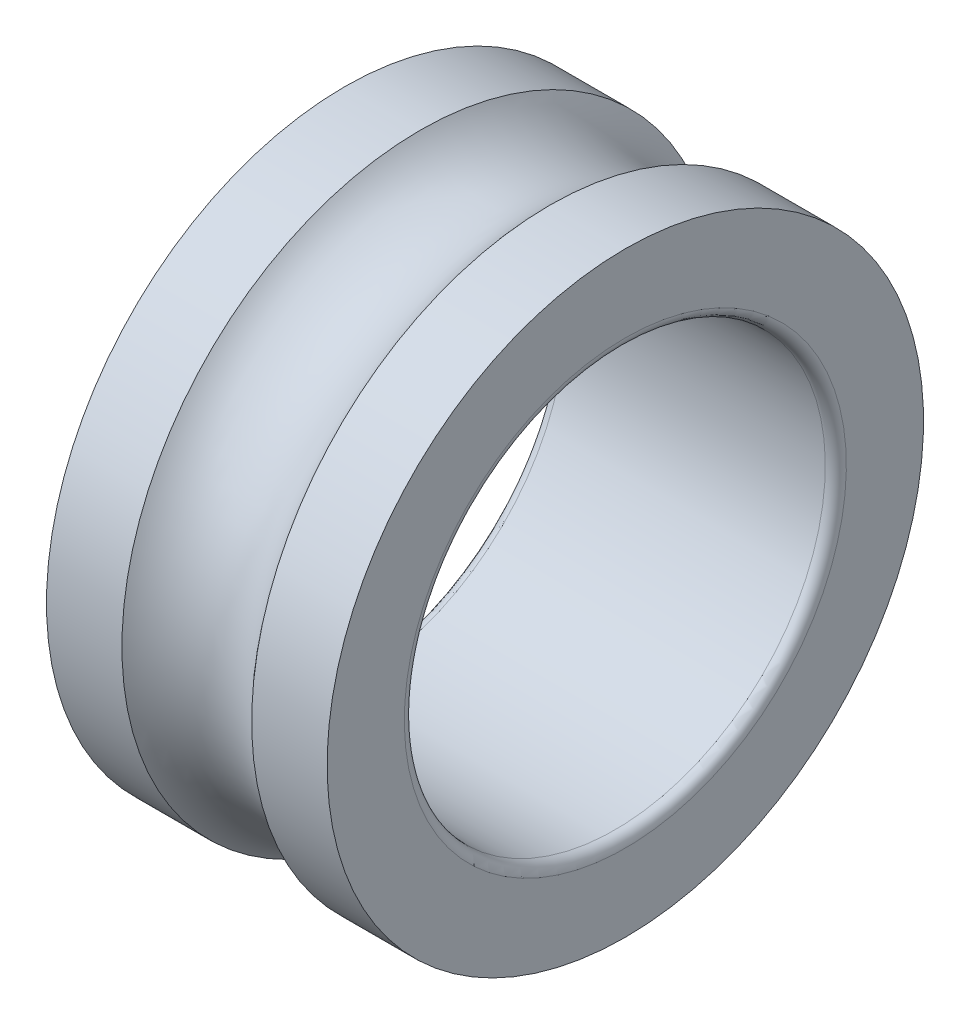
ISO-10303-21;
HEADER;
FILE_DESCRIPTION(('STEP AP214'),'2;1');
FILE_NAME('part.step','',(''),(''),'','','');
FILE_SCHEMA(('AUTOMOTIVE_DESIGN { 1 0 10303 214 1 1 1 1 }'));
ENDSEC;
DATA;
#1=APPLICATION_CONTEXT('core data for automotive mechanical design processes');
#2=APPLICATION_PROTOCOL_DEFINITION('international standard','automotive_design',2000,#1);
#3=PRODUCT_CONTEXT('',#1,'mechanical');
#4=PRODUCT('Part','Part','',(#3));
#5=PRODUCT_RELATED_PRODUCT_CATEGORY('part','',(#4));
#6=PRODUCT_DEFINITION_FORMATION('','',#4);
#7=PRODUCT_DEFINITION_CONTEXT('part definition',#1,'design');
#8=PRODUCT_DEFINITION('design','',#6,#7);
#9=PRODUCT_DEFINITION_SHAPE('','',#8);
#10=(LENGTH_UNIT() NAMED_UNIT(*) SI_UNIT(.MILLI.,.METRE.));
#11=(NAMED_UNIT(*) PLANE_ANGLE_UNIT() SI_UNIT($,.RADIAN.));
#12=(NAMED_UNIT(*) SI_UNIT($,.STERADIAN.) SOLID_ANGLE_UNIT());
#13=UNCERTAINTY_MEASURE_WITH_UNIT(LENGTH_MEASURE(1.E-05),#10,'distance_accuracy_value','');
#14=(GEOMETRIC_REPRESENTATION_CONTEXT(3) GLOBAL_UNCERTAINTY_ASSIGNED_CONTEXT((#13)) GLOBAL_UNIT_ASSIGNED_CONTEXT((#10,
#11,#12)) REPRESENTATION_CONTEXT('',''));
#15=CARTESIAN_POINT('',(0.,0.,0.));
#16=DIRECTION('',(0.,0.,1.));
#17=DIRECTION('',(1.,0.,0.));
#18=AXIS2_PLACEMENT_3D('',#15,#16,#17);
#19=CARTESIAN_POINT('',(6.92454867367814,0.,0.));
#20=DIRECTION('',(-1.,0.,0.));
#21=DIRECTION('',(0.,1.,0.));
#22=AXIS2_PLACEMENT_3D('',#19,#20,#21);
#23=CYLINDRICAL_SURFACE('',#22,8.5);
#24=CARTESIAN_POINT('',(5.84909734735627,0.,0.));
#25=DIRECTION('',(1.,0.,0.));
#26=DIRECTION('',(0.,1.,0.));
#27=AXIS2_PLACEMENT_3D('',#24,#25,#26);
#28=CIRCLE('',#27,8.5);
#29=CARTESIAN_POINT('',(5.84909734735627,8.5,0.));
#30=VERTEX_POINT('',#29);
#31=EDGE_CURVE('E11',#30,#30,#28,.T.);
#32=ORIENTED_EDGE('',*,*,#31,.T.);
#33=EDGE_LOOP('',(#32));
#34=FACE_BOUND('',#33,.T.);
#35=CARTESIAN_POINT('',(8.,0.,0.));
#36=DIRECTION('',(1.,0.,0.));
#37=DIRECTION('',(0.,1.,0.));
#38=AXIS2_PLACEMENT_3D('',#35,#36,#37);
#39=CIRCLE('',#38,8.5);
#40=CARTESIAN_POINT('',(8.,8.5,0.));
#41=VERTEX_POINT('',#40);
#42=EDGE_CURVE('E52',#41,#41,#39,.T.);
#43=ORIENTED_EDGE('',*,*,#42,.F.);
#44=EDGE_LOOP('',(#43));
#45=FACE_BOUND('',#44,.T.);
#46=ADVANCED_FACE('F17',(#34,#45),#23,.T.);
#47=CARTESIAN_POINT('',(4.,0.,0.));
#48=DIRECTION('',(1.,0.,0.));
#49=DIRECTION('',(0.,0.,-1.));
#50=AXIS2_PLACEMENT_3D('',#47,#48,#49);
#51=TOROIDAL_SURFACE('',#50,10.,2.381);
#52=CARTESIAN_POINT('',(2.15090265264373,0.,0.));
#53=DIRECTION('',(1.,0.,0.));
#54=DIRECTION('',(0.,1.,0.));
#55=AXIS2_PLACEMENT_3D('',#52,#53,#54);
#56=CIRCLE('',#55,8.5);
#57=CARTESIAN_POINT('',(2.15090265264373,8.5,0.));
#58=VERTEX_POINT('',#57);
#59=EDGE_CURVE('E27',#58,#58,#56,.T.);
#60=ORIENTED_EDGE('',*,*,#59,.T.);
#61=EDGE_LOOP('',(#60));
#62=FACE_BOUND('',#61,.T.);
#63=ORIENTED_EDGE('',*,*,#31,.F.);
#64=EDGE_LOOP('',(#63));
#65=FACE_BOUND('',#64,.T.);
#66=ADVANCED_FACE('F19',(#62,#65),#51,.F.);
#67=CARTESIAN_POINT('',(1.07545132632186,0.,0.));
#68=DIRECTION('',(-1.,0.,0.));
#69=DIRECTION('',(0.,1.,0.));
#70=AXIS2_PLACEMENT_3D('',#67,#68,#69);
#71=CYLINDRICAL_SURFACE('',#70,8.5);
#72=CARTESIAN_POINT('',(0.,0.,0.));
#73=DIRECTION('',(1.,0.,0.));
#74=DIRECTION('',(0.,1.,0.));
#75=AXIS2_PLACEMENT_3D('',#72,#73,#74);
#76=CIRCLE('',#75,8.5);
#77=CARTESIAN_POINT('',(0.,8.5,0.));
#78=VERTEX_POINT('',#77);
#79=EDGE_CURVE('E63',#78,#78,#76,.T.);
#80=ORIENTED_EDGE('',*,*,#79,.T.);
#81=EDGE_LOOP('',(#80));
#82=FACE_BOUND('',#81,.T.);
#83=ORIENTED_EDGE('',*,*,#59,.F.);
#84=EDGE_LOOP('',(#83));
#85=FACE_BOUND('',#84,.T.);
#86=ADVANCED_FACE('F84',(#82,#85),#71,.T.);
#87=CARTESIAN_POINT('',(0.,7.4,0.));
#88=DIRECTION('',(-1.,0.,0.));
#89=DIRECTION('',(0.,-1.,0.));
#90=AXIS2_PLACEMENT_3D('',#87,#88,#89);
#91=PLANE('',#90);
#92=CARTESIAN_POINT('',(0.,0.,0.));
#93=DIRECTION('',(1.,0.,0.));
#94=DIRECTION('',(0.,1.,0.));
#95=AXIS2_PLACEMENT_3D('',#92,#93,#94);
#96=CIRCLE('',#95,6.3);
#97=CARTESIAN_POINT('',(0.,6.3,0.));
#98=VERTEX_POINT('',#97);
#99=EDGE_CURVE('E21',#98,#98,#96,.T.);
#100=ORIENTED_EDGE('',*,*,#99,.T.);
#101=EDGE_LOOP('',(#100));
#102=FACE_BOUND('',#101,.T.);
#103=ORIENTED_EDGE('',*,*,#79,.F.);
#104=EDGE_LOOP('',(#103));
#105=FACE_BOUND('',#104,.T.);
#106=ADVANCED_FACE('F69',(#102,#105),#91,.T.);
#107=CARTESIAN_POINT('',(0.3,0.,0.));
#108=DIRECTION('',(1.,0.,0.));
#109=DIRECTION('',(0.,0.,-1.));
#110=AXIS2_PLACEMENT_3D('',#107,#108,#109);
#111=TOROIDAL_SURFACE('',#110,6.3,0.3);
#112=CARTESIAN_POINT('',(0.3,0.,0.));
#113=DIRECTION('',(1.,0.,0.));
#114=DIRECTION('',(0.,1.,0.));
#115=AXIS2_PLACEMENT_3D('',#112,#113,#114);
#116=CIRCLE('',#115,6.);
#117=CARTESIAN_POINT('',(0.3,6.,0.));
#118=VERTEX_POINT('',#117);
#119=EDGE_CURVE('E59',#118,#118,#116,.T.);
#120=ORIENTED_EDGE('',*,*,#119,.T.);
#121=EDGE_LOOP('',(#120));
#122=FACE_BOUND('',#121,.T.);
#123=ORIENTED_EDGE('',*,*,#99,.F.);
#124=EDGE_LOOP('',(#123));
#125=FACE_BOUND('',#124,.T.);
#126=ADVANCED_FACE('F72',(#122,#125),#111,.T.);
#127=CARTESIAN_POINT('',(4.,0.,0.));
#128=DIRECTION('',(-1.,0.,0.));
#129=DIRECTION('',(0.,1.,0.));
#130=AXIS2_PLACEMENT_3D('',#127,#128,#129);
#131=CYLINDRICAL_SURFACE('',#130,6.);
#132=CARTESIAN_POINT('',(7.7,0.,0.));
#133=DIRECTION('',(1.,0.,0.));
#134=DIRECTION('',(0.,1.,0.));
#135=AXIS2_PLACEMENT_3D('',#132,#133,#134);
#136=CIRCLE('',#135,6.);
#137=CARTESIAN_POINT('',(7.7,6.,0.));
#138=VERTEX_POINT('',#137);
#139=EDGE_CURVE('E56',#138,#138,#136,.T.);
#140=ORIENTED_EDGE('',*,*,#139,.T.);
#141=EDGE_LOOP('',(#140));
#142=FACE_BOUND('',#141,.T.);
#143=ORIENTED_EDGE('',*,*,#119,.F.);
#144=EDGE_LOOP('',(#143));
#145=FACE_BOUND('',#144,.T.);
#146=ADVANCED_FACE('F74',(#142,#145),#131,.F.);
#147=CARTESIAN_POINT('',(7.7,0.,0.));
#148=DIRECTION('',(1.,0.,0.));
#149=DIRECTION('',(0.,0.,-1.));
#150=AXIS2_PLACEMENT_3D('',#147,#148,#149);
#151=TOROIDAL_SURFACE('',#150,6.3,0.3);
#152=CARTESIAN_POINT('',(8.,0.,0.));
#153=DIRECTION('',(1.,0.,0.));
#154=DIRECTION('',(0.,1.,0.));
#155=AXIS2_PLACEMENT_3D('',#152,#153,#154);
#156=CIRCLE('',#155,6.3);
#157=CARTESIAN_POINT('',(8.,6.3,0.));
#158=VERTEX_POINT('',#157);
#159=EDGE_CURVE('E57',#158,#158,#156,.T.);
#160=ORIENTED_EDGE('',*,*,#159,.T.);
#161=EDGE_LOOP('',(#160));
#162=FACE_BOUND('',#161,.T.);
#163=ORIENTED_EDGE('',*,*,#139,.F.);
#164=EDGE_LOOP('',(#163));
#165=FACE_BOUND('',#164,.T.);
#166=ADVANCED_FACE('F81',(#162,#165),#151,.T.);
#167=CARTESIAN_POINT('',(8.,7.4,0.));
#168=DIRECTION('',(1.,0.,0.));
#169=DIRECTION('',(0.,1.,0.));
#170=AXIS2_PLACEMENT_3D('',#167,#168,#169);
#171=PLANE('',#170);
#172=ORIENTED_EDGE('',*,*,#42,.T.);
#173=EDGE_LOOP('',(#172));
#174=FACE_BOUND('',#173,.T.);
#175=ORIENTED_EDGE('',*,*,#159,.F.);
#176=EDGE_LOOP('',(#175));
#177=FACE_BOUND('',#176,.T.);
#178=ADVANCED_FACE('F53',(#174,#177),#171,.T.);
#179=CLOSED_SHELL('',(#46,#66,#86,#106,#126,#146,#166,#178));
#180=MANIFOLD_SOLID_BREP('B1',#179);
#181=ADVANCED_BREP_SHAPE_REPRESENTATION('',(#18,#180),#14);
#182=SHAPE_DEFINITION_REPRESENTATION(#9,#181);
ENDSEC;
END-ISO-10303-21;
